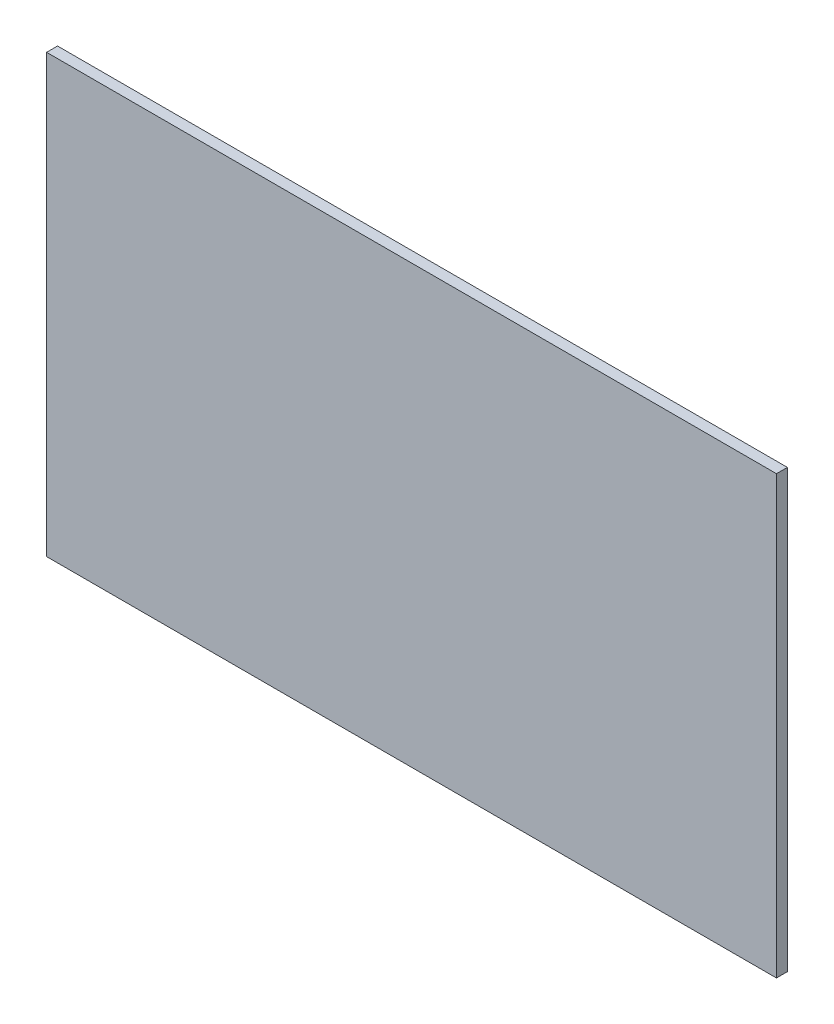
ISO-10303-21;
HEADER;
FILE_DESCRIPTION(('STEP AP214'),'2;1');
FILE_NAME('part.step','',(''),(''),'','','');
FILE_SCHEMA(('AUTOMOTIVE_DESIGN { 1 0 10303 214 1 1 1 1 }'));
ENDSEC;
DATA;
#1=APPLICATION_CONTEXT('core data for automotive mechanical design processes');
#2=APPLICATION_PROTOCOL_DEFINITION('international standard','automotive_design',2000,#1);
#3=PRODUCT_CONTEXT('',#1,'mechanical');
#4=PRODUCT('Part','Part','',(#3));
#5=PRODUCT_RELATED_PRODUCT_CATEGORY('part','',(#4));
#6=PRODUCT_DEFINITION_FORMATION('','',#4);
#7=PRODUCT_DEFINITION_CONTEXT('part definition',#1,'design');
#8=PRODUCT_DEFINITION('design','',#6,#7);
#9=PRODUCT_DEFINITION_SHAPE('','',#8);
#10=(LENGTH_UNIT() NAMED_UNIT(*) SI_UNIT(.MILLI.,.METRE.));
#11=(NAMED_UNIT(*) PLANE_ANGLE_UNIT() SI_UNIT($,.RADIAN.));
#12=(NAMED_UNIT(*) SI_UNIT($,.STERADIAN.) SOLID_ANGLE_UNIT());
#13=UNCERTAINTY_MEASURE_WITH_UNIT(LENGTH_MEASURE(1.E-05),#10,'distance_accuracy_value','');
#14=(GEOMETRIC_REPRESENTATION_CONTEXT(3) GLOBAL_UNCERTAINTY_ASSIGNED_CONTEXT((#13)) GLOBAL_UNIT_ASSIGNED_CONTEXT((#10,
#11,#12)) REPRESENTATION_CONTEXT('',''));
#15=CARTESIAN_POINT('',(0.,0.,0.));
#16=DIRECTION('',(0.,0.,1.));
#17=DIRECTION('',(1.,0.,0.));
#18=AXIS2_PLACEMENT_3D('',#15,#16,#17);
#19=CARTESIAN_POINT('',(0.,100.,0.));
#20=DIRECTION('',(1.,0.,0.));
#21=DIRECTION('',(0.,0.,-1.));
#22=AXIS2_PLACEMENT_3D('',#19,#20,#21);
#23=PLANE('',#22);
#24=DIRECTION('',(0.,0.,1.));
#25=VECTOR('',#24,1.);
#26=CARTESIAN_POINT('',(0.,0.,0.));
#27=LINE('',#26,#25);
#28=CARTESIAN_POINT('',(0.,0.,0.));
#29=VERTEX_POINT('',#28);
#30=CARTESIAN_POINT('',(0.,0.,2.5));
#31=VERTEX_POINT('',#30);
#32=EDGE_CURVE('E94',#29,#31,#27,.T.);
#33=ORIENTED_EDGE('',*,*,#32,.T.);
#34=DIRECTION('',(0.,-1.,0.));
#35=VECTOR('',#34,1.);
#36=CARTESIAN_POINT('',(0.,100.,2.5));
#37=LINE('',#36,#35);
#38=CARTESIAN_POINT('',(0.,100.,2.5));
#39=VERTEX_POINT('',#38);
#40=EDGE_CURVE('E11',#39,#31,#37,.T.);
#41=ORIENTED_EDGE('',*,*,#40,.F.);
#42=DIRECTION('',(0.,0.,1.));
#43=VECTOR('',#42,1.);
#44=CARTESIAN_POINT('',(0.,100.,0.));
#45=LINE('',#44,#43);
#46=CARTESIAN_POINT('',(0.,100.,0.));
#47=VERTEX_POINT('',#46);
#48=EDGE_CURVE('E82',#47,#39,#45,.T.);
#49=ORIENTED_EDGE('',*,*,#48,.F.);
#50=DIRECTION('',(0.,-1.,0.));
#51=VECTOR('',#50,1.);
#52=CARTESIAN_POINT('',(0.,100.,0.));
#53=LINE('',#52,#51);
#54=EDGE_CURVE('E90',#47,#29,#53,.T.);
#55=ORIENTED_EDGE('',*,*,#54,.T.);
#56=EDGE_LOOP('',(#33,#41,#49,#55));
#57=FACE_BOUND('',#56,.T.);
#58=ADVANCED_FACE('F31',(#57),#23,.F.);
#59=CARTESIAN_POINT('',(0.,100.,2.5));
#60=DIRECTION('',(0.,0.,-1.));
#61=DIRECTION('',(-1.,0.,0.));
#62=AXIS2_PLACEMENT_3D('',#59,#60,#61);
#63=PLANE('',#62);
#64=DIRECTION('',(1.,0.,0.));
#65=VECTOR('',#64,1.);
#66=CARTESIAN_POINT('',(0.,0.,2.5));
#67=LINE('',#66,#65);
#68=CARTESIAN_POINT('',(167.117912718032,0.,2.5));
#69=VERTEX_POINT('',#68);
#70=EDGE_CURVE('E86',#31,#69,#67,.T.);
#71=ORIENTED_EDGE('',*,*,#70,.T.);
#72=DIRECTION('',(0.,-1.,0.));
#73=VECTOR('',#72,1.);
#74=CARTESIAN_POINT('',(167.117912718032,100.,2.5));
#75=LINE('',#74,#73);
#76=CARTESIAN_POINT('',(167.117912718032,100.,2.5));
#77=VERTEX_POINT('',#76);
#78=EDGE_CURVE('E39',#77,#69,#75,.T.);
#79=ORIENTED_EDGE('',*,*,#78,.F.);
#80=DIRECTION('',(1.,0.,0.));
#81=VECTOR('',#80,1.);
#82=CARTESIAN_POINT('',(0.,100.,2.5));
#83=LINE('',#82,#81);
#84=EDGE_CURVE('E77',#39,#77,#83,.T.);
#85=ORIENTED_EDGE('',*,*,#84,.F.);
#86=ORIENTED_EDGE('',*,*,#40,.T.);
#87=EDGE_LOOP('',(#71,#79,#85,#86));
#88=FACE_BOUND('',#87,.T.);
#89=ADVANCED_FACE('F85',(#88),#63,.F.);
#90=CARTESIAN_POINT('',(167.117912718032,100.,0.));
#91=DIRECTION('',(-1.,0.,0.));
#92=DIRECTION('',(0.,0.,1.));
#93=AXIS2_PLACEMENT_3D('',#90,#91,#92);
#94=PLANE('',#93);
#95=DIRECTION('',(0.,0.,-1.));
#96=VECTOR('',#95,1.);
#97=CARTESIAN_POINT('',(167.117912718032,0.,0.));
#98=LINE('',#97,#96);
#99=CARTESIAN_POINT('',(167.117912718032,0.,0.));
#100=VERTEX_POINT('',#99);
#101=EDGE_CURVE('E64',#69,#100,#98,.T.);
#102=ORIENTED_EDGE('',*,*,#101,.T.);
#103=DIRECTION('',(0.,-1.,0.));
#104=VECTOR('',#103,1.);
#105=CARTESIAN_POINT('',(167.117912718032,100.,0.));
#106=LINE('',#105,#104);
#107=CARTESIAN_POINT('',(167.117912718032,100.,0.));
#108=VERTEX_POINT('',#107);
#109=EDGE_CURVE('E87',#108,#100,#106,.T.);
#110=ORIENTED_EDGE('',*,*,#109,.F.);
#111=DIRECTION('',(0.,0.,-1.));
#112=VECTOR('',#111,1.);
#113=CARTESIAN_POINT('',(167.117912718032,100.,0.));
#114=LINE('',#113,#112);
#115=EDGE_CURVE('E80',#77,#108,#114,.T.);
#116=ORIENTED_EDGE('',*,*,#115,.F.);
#117=ORIENTED_EDGE('',*,*,#78,.T.);
#118=EDGE_LOOP('',(#102,#110,#116,#117));
#119=FACE_BOUND('',#118,.T.);
#120=ADVANCED_FACE('F88',(#119),#94,.F.);
#121=CARTESIAN_POINT('',(0.,100.,0.));
#122=DIRECTION('',(0.,0.,1.));
#123=DIRECTION('',(1.,0.,0.));
#124=AXIS2_PLACEMENT_3D('',#121,#122,#123);
#125=PLANE('',#124);
#126=DIRECTION('',(-1.,0.,0.));
#127=VECTOR('',#126,1.);
#128=CARTESIAN_POINT('',(0.,0.,0.));
#129=LINE('',#128,#127);
#130=EDGE_CURVE('E70',#100,#29,#129,.T.);
#131=ORIENTED_EDGE('',*,*,#130,.T.);
#132=ORIENTED_EDGE('',*,*,#54,.F.);
#133=DIRECTION('',(-1.,0.,0.));
#134=VECTOR('',#133,1.);
#135=CARTESIAN_POINT('',(0.,100.,0.));
#136=LINE('',#135,#134);
#137=EDGE_CURVE('E47',#108,#47,#136,.T.);
#138=ORIENTED_EDGE('',*,*,#137,.F.);
#139=ORIENTED_EDGE('',*,*,#109,.T.);
#140=EDGE_LOOP('',(#131,#132,#138,#139));
#141=FACE_BOUND('',#140,.T.);
#142=ADVANCED_FACE('F101',(#141),#125,.F.);
#143=CARTESIAN_POINT('',(0.,100.,2.5));
#144=DIRECTION('',(0.,1.,0.));
#145=DIRECTION('',(0.,0.,1.));
#146=AXIS2_PLACEMENT_3D('',#143,#144,#145);
#147=PLANE('',#146);
#148=ORIENTED_EDGE('',*,*,#48,.T.);
#149=ORIENTED_EDGE('',*,*,#84,.T.);
#150=ORIENTED_EDGE('',*,*,#115,.T.);
#151=ORIENTED_EDGE('',*,*,#137,.T.);
#152=EDGE_LOOP('',(#148,#149,#150,#151));
#153=FACE_BOUND('',#152,.T.);
#154=ADVANCED_FACE('F78',(#153),#147,.T.);
#155=CARTESIAN_POINT('',(0.,0.,2.5));
#156=DIRECTION('',(0.,1.,0.));
#157=DIRECTION('',(0.,0.,1.));
#158=AXIS2_PLACEMENT_3D('',#155,#156,#157);
#159=PLANE('',#158);
#160=ORIENTED_EDGE('',*,*,#32,.F.);
#161=ORIENTED_EDGE('',*,*,#130,.F.);
#162=ORIENTED_EDGE('',*,*,#101,.F.);
#163=ORIENTED_EDGE('',*,*,#70,.F.);
#164=EDGE_LOOP('',(#160,#161,#162,#163));
#165=FACE_BOUND('',#164,.T.);
#166=ADVANCED_FACE('F104',(#165),#159,.F.);
#167=CLOSED_SHELL('',(#58,#89,#120,#142,#154,#166));
#168=MANIFOLD_SOLID_BREP('B2',#167);
#169=ADVANCED_BREP_SHAPE_REPRESENTATION('',(#18,#168),#14);
#170=SHAPE_DEFINITION_REPRESENTATION(#9,#169);
ENDSEC;
END-ISO-10303-21;
